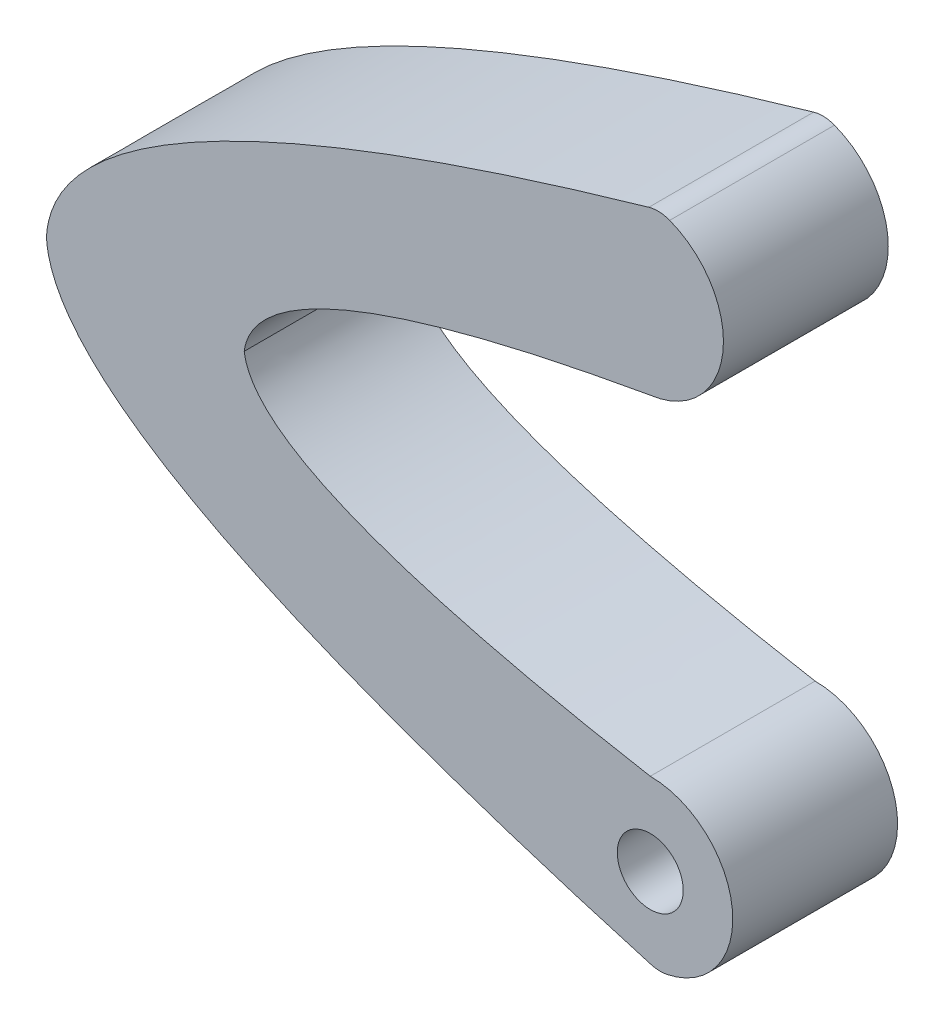
ISO-10303-21;
HEADER;
FILE_DESCRIPTION(('STEP AP214'),'2;1');
FILE_NAME('part.step','',(''),(''),'','','');
FILE_SCHEMA(('AUTOMOTIVE_DESIGN { 1 0 10303 214 1 1 1 1 }'));
ENDSEC;
DATA;
#1=APPLICATION_CONTEXT('core data for automotive mechanical design processes');
#2=APPLICATION_PROTOCOL_DEFINITION('international standard','automotive_design',2000,#1);
#3=PRODUCT_CONTEXT('',#1,'mechanical');
#4=PRODUCT('Part','Part','',(#3));
#5=PRODUCT_RELATED_PRODUCT_CATEGORY('part','',(#4));
#6=PRODUCT_DEFINITION_FORMATION('','',#4);
#7=PRODUCT_DEFINITION_CONTEXT('part definition',#1,'design');
#8=PRODUCT_DEFINITION('design','',#6,#7);
#9=PRODUCT_DEFINITION_SHAPE('','',#8);
#10=(LENGTH_UNIT() NAMED_UNIT(*) SI_UNIT(.MILLI.,.METRE.));
#11=(NAMED_UNIT(*) PLANE_ANGLE_UNIT() SI_UNIT($,.RADIAN.));
#12=(NAMED_UNIT(*) SI_UNIT($,.STERADIAN.) SOLID_ANGLE_UNIT());
#13=UNCERTAINTY_MEASURE_WITH_UNIT(LENGTH_MEASURE(1.E-05),#10,'distance_accuracy_value','');
#14=(GEOMETRIC_REPRESENTATION_CONTEXT(3) GLOBAL_UNCERTAINTY_ASSIGNED_CONTEXT((#13)) GLOBAL_UNIT_ASSIGNED_CONTEXT((#10,
#11,#12)) REPRESENTATION_CONTEXT('',''));
#15=CARTESIAN_POINT('',(0.,0.,0.));
#16=DIRECTION('',(0.,0.,1.));
#17=DIRECTION('',(1.,0.,0.));
#18=AXIS2_PLACEMENT_3D('',#15,#16,#17);
#19=CARTESIAN_POINT('',(47.5152011648523,-11.3632797067987,10.));
#20=CARTESIAN_POINT('',(10.9332546142539,-0.926951504292355,10.));
#21=CARTESIAN_POINT('',(10.4116613635407,8.6362173549119,10.));
#22=B_SPLINE_CURVE_WITH_KNOTS('',2,(#19,#20,#21),.UNSPECIFIED.,.F.,.F.,(3,3),(0.,
0.478869131783004),.UNSPECIFIED.);
#23=DIRECTION('',(0.,0.,-1.));
#24=VECTOR('',#23,1.);
#25=SURFACE_OF_LINEAR_EXTRUSION('',#22,#24);
#26=CARTESIAN_POINT('',(47.5152011648523,-11.3632797067987,0.));
#27=CARTESIAN_POINT('',(10.9332546142539,-0.926951504292355,0.));
#28=CARTESIAN_POINT('',(10.4116613635407,8.6362173549119,0.));
#29=B_SPLINE_CURVE_WITH_KNOTS('',2,(#26,#27,#28),.UNSPECIFIED.,.F.,.F.,(3,3),(0.,
0.478869131783004),.UNSPECIFIED.);
#30=CARTESIAN_POINT('',(47.1036602242918,-11.2455731833832,0.));
#31=VERTEX_POINT('',#30);
#32=CARTESIAN_POINT('',(10.4116613635407,8.6362173549119,0.));
#33=VERTEX_POINT('',#32);
#34=EDGE_CURVE('E190',#31,#33,#29,.T.);
#35=ORIENTED_EDGE('',*,*,#34,.F.);
#36=DIRECTION('',(0.,0.,-1.));
#37=VECTOR('',#36,1.);
#38=CARTESIAN_POINT('',(47.1036602242918,-11.2455731833832,0.));
#39=LINE('',#38,#37);
#40=CARTESIAN_POINT('',(47.1036602242918,-11.2455731833832,10.));
#41=VERTEX_POINT('',#40);
#42=EDGE_CURVE('E43',#31,#41,#39,.F.);
#43=ORIENTED_EDGE('',*,*,#42,.T.);
#44=CARTESIAN_POINT('',(10.4116613635407,8.6362173549119,10.));
#45=VERTEX_POINT('',#44);
#46=EDGE_CURVE('E109',#41,#45,#22,.T.);
#47=ORIENTED_EDGE('',*,*,#46,.T.);
#48=DIRECTION('',(0.,0.,-1.));
#49=VECTOR('',#48,1.);
#50=CARTESIAN_POINT('',(10.4116613635407,8.6362173549119,10.));
#51=LINE('',#50,#49);
#52=EDGE_CURVE('E169',#45,#33,#51,.T.);
#53=ORIENTED_EDGE('',*,*,#52,.T.);
#54=EDGE_LOOP('',(#35,#43,#47,#53));
#55=FACE_BOUND('',#54,.T.);
#56=ADVANCED_FACE('F35',(#55),#25,.T.);
#57=CARTESIAN_POINT('',(47.0465762802656,-6.37976549751633,10.));
#58=DIRECTION('',(0.,0.,-1.));
#59=DIRECTION('',(-1.,0.,0.));
#60=AXIS2_PLACEMENT_3D('',#57,#58,#59);
#61=CYLINDRICAL_SURFACE('',#60,5.00549929143665);
#62=CARTESIAN_POINT('',(47.0465762802656,-6.37976549751633,10.));
#63=DIRECTION('',(0.,0.,1.));
#64=DIRECTION('',(1.,0.,0.));
#65=AXIS2_PLACEMENT_3D('',#62,#63,#64);
#66=CIRCLE('',#65,5.00549929143665);
#67=CARTESIAN_POINT('',(48.0597671727555,-11.2816495610115,10.));
#68=VERTEX_POINT('',#67);
#69=CARTESIAN_POINT('',(47.0465762802656,-1.37426620607967,10.));
#70=VERTEX_POINT('',#69);
#71=EDGE_CURVE('E97',#68,#70,#66,.T.);
#72=ORIENTED_EDGE('',*,*,#71,.F.);
#73=DIRECTION('',(0.,0.,-1.));
#74=VECTOR('',#73,1.);
#75=CARTESIAN_POINT('',(48.0597671727555,-11.2816495610115,10.));
#76=LINE('',#75,#74);
#77=CARTESIAN_POINT('',(48.0597671727555,-11.2816495610115,0.));
#78=VERTEX_POINT('',#77);
#79=EDGE_CURVE('E184',#68,#78,#76,.T.);
#80=ORIENTED_EDGE('',*,*,#79,.T.);
#81=CARTESIAN_POINT('',(47.0465762802656,-6.37976549751633,0.));
#82=DIRECTION('',(0.,0.,1.));
#83=DIRECTION('',(1.,0.,0.));
#84=AXIS2_PLACEMENT_3D('',#81,#82,#83);
#85=CIRCLE('',#84,5.00549929143665);
#86=CARTESIAN_POINT('',(47.0465762802656,-1.37426620607967,0.));
#87=VERTEX_POINT('',#86);
#88=EDGE_CURVE('E114',#78,#87,#85,.T.);
#89=ORIENTED_EDGE('',*,*,#88,.T.);
#90=DIRECTION('',(0.,0.,-1.));
#91=VECTOR('',#90,1.);
#92=CARTESIAN_POINT('',(47.0465762802656,-1.37426620607967,10.));
#93=LINE('',#92,#91);
#94=EDGE_CURVE('E112',#70,#87,#93,.T.);
#95=ORIENTED_EDGE('',*,*,#94,.F.);
#96=EDGE_LOOP('',(#72,#80,#89,#95));
#97=FACE_BOUND('',#96,.T.);
#98=ADVANCED_FACE('F113',(#97),#61,.T.);
#99=CARTESIAN_POINT('',(47.0465762802656,-1.37426620607967,10.));
#100=CARTESIAN_POINT('',(23.1494655964249,2.85669468360767,10.));
#101=CARTESIAN_POINT('',(22.4116613635407,8.6362173549119,10.));
#102=B_SPLINE_CURVE_WITH_KNOTS('',2,(#99,#100,#101),.UNSPECIFIED.,.F.,.F.,(3,3),(0.,
0.485397068416266),.UNSPECIFIED.);
#103=DIRECTION('',(0.,0.,-1.));
#104=VECTOR('',#103,1.);
#105=SURFACE_OF_LINEAR_EXTRUSION('',#102,#104);
#106=CARTESIAN_POINT('',(47.0465762802656,-1.37426620607967,0.));
#107=CARTESIAN_POINT('',(23.1494655964249,2.85669468360767,0.));
#108=CARTESIAN_POINT('',(22.4116613635407,8.6362173549119,0.));
#109=B_SPLINE_CURVE_WITH_KNOTS('',2,(#106,#107,#108),.UNSPECIFIED.,.F.,.F.,(3,3),(0.,
0.485397068416266),.UNSPECIFIED.);
#110=CARTESIAN_POINT('',(22.4116613635407,8.6362173549119,0.));
#111=VERTEX_POINT('',#110);
#112=EDGE_CURVE('E189',#87,#111,#109,.T.);
#113=ORIENTED_EDGE('',*,*,#112,.T.);
#114=DIRECTION('',(0.,0.,-1.));
#115=VECTOR('',#114,1.);
#116=CARTESIAN_POINT('',(22.4116613635407,8.6362173549119,10.));
#117=LINE('',#116,#115);
#118=CARTESIAN_POINT('',(22.4116613635407,8.6362173549119,10.));
#119=VERTEX_POINT('',#118);
#120=EDGE_CURVE('E119',#119,#111,#117,.T.);
#121=ORIENTED_EDGE('',*,*,#120,.F.);
#122=EDGE_CURVE('E103',#70,#119,#102,.T.);
#123=ORIENTED_EDGE('',*,*,#122,.F.);
#124=ORIENTED_EDGE('',*,*,#94,.T.);
#125=EDGE_LOOP('',(#113,#121,#123,#124));
#126=FACE_BOUND('',#125,.T.);
#127=ADVANCED_FACE('F121',(#126),#105,.F.);
#128=CARTESIAN_POINT('',(47.0465762802655,18.6477067924824,10.));
#129=CARTESIAN_POINT('',(23.1494655964249,14.4157400262161,10.));
#130=CARTESIAN_POINT('',(22.4116613635407,8.6362173549119,10.));
#131=B_SPLINE_CURVE_WITH_KNOTS('',2,(#128,#129,#130),.UNSPECIFIED.,.F.,.F.,(3,3),(0.,
0.485397068416266),.UNSPECIFIED.);
#132=DIRECTION('',(0.,0.,-1.));
#133=VECTOR('',#132,1.);
#134=SURFACE_OF_LINEAR_EXTRUSION('',#131,#133);
#135=CARTESIAN_POINT('',(47.0465762802655,18.6477067924824,0.));
#136=CARTESIAN_POINT('',(23.1494655964249,14.4157400262161,0.));
#137=CARTESIAN_POINT('',(22.4116613635407,8.6362173549119,0.));
#138=B_SPLINE_CURVE_WITH_KNOTS('',2,(#135,#136,#137),.UNSPECIFIED.,.F.,.F.,(3,3),(0.,
0.485397068416266),.UNSPECIFIED.);
#139=CARTESIAN_POINT('',(47.0465762802655,18.6477067924824,0.));
#140=VERTEX_POINT('',#139);
#141=EDGE_CURVE('E192',#140,#111,#138,.T.);
#142=ORIENTED_EDGE('',*,*,#141,.F.);
#143=DIRECTION('',(0.,0.,-1.));
#144=VECTOR('',#143,1.);
#145=CARTESIAN_POINT('',(47.0465762802655,18.6477067924824,10.));
#146=LINE('',#145,#144);
#147=CARTESIAN_POINT('',(47.0465762802655,18.6477067924824,10.));
#148=VERTEX_POINT('',#147);
#149=EDGE_CURVE('E171',#148,#140,#146,.T.);
#150=ORIENTED_EDGE('',*,*,#149,.F.);
#151=EDGE_CURVE('E123',#148,#119,#131,.T.);
#152=ORIENTED_EDGE('',*,*,#151,.T.);
#153=ORIENTED_EDGE('',*,*,#120,.T.);
#154=EDGE_LOOP('',(#142,#150,#152,#153));
#155=FACE_BOUND('',#154,.T.);
#156=ADVANCED_FACE('F142',(#155),#134,.T.);
#157=CARTESIAN_POINT('',(46.4116613635407,23.682992501722,10.));
#158=DIRECTION('',(0.,0.,-1.));
#159=DIRECTION('',(-1.,0.,0.));
#160=AXIS2_PLACEMENT_3D('',#157,#158,#159);
#161=CYLINDRICAL_SURFACE('',#160,5.07515705423518);
#162=CARTESIAN_POINT('',(46.4116613635407,23.682992501722,0.));
#163=DIRECTION('',(0.,0.,1.));
#164=DIRECTION('',(1.,0.,0.));
#165=AXIS2_PLACEMENT_3D('',#162,#163,#164);
#166=CIRCLE('',#165,5.07515705423518);
#167=CARTESIAN_POINT('',(48.2254105436071,28.4229854381051,0.));
#168=VERTEX_POINT('',#167);
#169=EDGE_CURVE('E163',#168,#140,#166,.F.);
#170=ORIENTED_EDGE('',*,*,#169,.F.);
#171=DIRECTION('',(0.,0.,-1.));
#172=VECTOR('',#171,1.);
#173=CARTESIAN_POINT('',(48.2254105436071,28.4229854381051,10.));
#174=LINE('',#173,#172);
#175=CARTESIAN_POINT('',(48.2254105436071,28.4229854381051,10.));
#176=VERTEX_POINT('',#175);
#177=EDGE_CURVE('E180',#168,#176,#174,.F.);
#178=ORIENTED_EDGE('',*,*,#177,.T.);
#179=CARTESIAN_POINT('',(46.4116613635407,23.682992501722,10.));
#180=DIRECTION('',(0.,0.,1.));
#181=DIRECTION('',(1.,0.,0.));
#182=AXIS2_PLACEMENT_3D('',#179,#180,#181);
#183=CIRCLE('',#182,5.07515705423518);
#184=EDGE_CURVE('E125',#176,#148,#183,.F.);
#185=ORIENTED_EDGE('',*,*,#184,.T.);
#186=ORIENTED_EDGE('',*,*,#149,.T.);
#187=EDGE_LOOP('',(#170,#178,#185,#186));
#188=FACE_BOUND('',#187,.T.);
#189=ADVANCED_FACE('F215',(#188),#161,.T.);
#190=CARTESIAN_POINT('',(47.5152011648523,28.6367202932013,10.));
#191=CARTESIAN_POINT('',(10.9332546142539,18.1993862141162,10.));
#192=CARTESIAN_POINT('',(10.4116613635407,8.6362173549119,10.));
#193=B_SPLINE_CURVE_WITH_KNOTS('',2,(#190,#191,#192),.UNSPECIFIED.,.F.,.F.,(3,3),(0.,
0.478869131783004),.UNSPECIFIED.);
#194=DIRECTION('',(0.,0.,-1.));
#195=VECTOR('',#194,1.);
#196=SURFACE_OF_LINEAR_EXTRUSION('',#193,#195);
#197=CARTESIAN_POINT('',(46.9584044816055,28.4773091452483,10.));
#198=VERTEX_POINT('',#197);
#199=EDGE_CURVE('E220',#198,#45,#193,.T.);
#200=ORIENTED_EDGE('',*,*,#199,.F.);
#201=DIRECTION('',(0.,0.,-1.));
#202=VECTOR('',#201,1.);
#203=CARTESIAN_POINT('',(46.9584044816055,28.4773091452483,10.));
#204=LINE('',#203,#202);
#205=CARTESIAN_POINT('',(46.9584044816055,28.4773091452483,0.));
#206=VERTEX_POINT('',#205);
#207=EDGE_CURVE('E118',#198,#206,#204,.T.);
#208=ORIENTED_EDGE('',*,*,#207,.T.);
#209=CARTESIAN_POINT('',(47.5152011648523,28.6367202932013,0.));
#210=CARTESIAN_POINT('',(10.9332546142539,18.1993862141162,0.));
#211=CARTESIAN_POINT('',(10.4116613635407,8.6362173549119,0.));
#212=B_SPLINE_CURVE_WITH_KNOTS('',2,(#209,#210,#211),.UNSPECIFIED.,.F.,.F.,(3,3),(0.,
0.478869131783004),.UNSPECIFIED.);
#213=EDGE_CURVE('E158',#206,#33,#212,.T.);
#214=ORIENTED_EDGE('',*,*,#213,.T.);
#215=ORIENTED_EDGE('',*,*,#52,.F.);
#216=EDGE_LOOP('',(#200,#208,#214,#215));
#217=FACE_BOUND('',#216,.T.);
#218=ADVANCED_FACE('F224',(#217),#196,.F.);
#219=CARTESIAN_POINT('',(47.0465762802656,-6.37976549751633,10.));
#220=DIRECTION('',(0.,0.,-1.));
#221=DIRECTION('',(-1.,0.,0.));
#222=AXIS2_PLACEMENT_3D('',#219,#220,#221);
#223=CYLINDRICAL_SURFACE('',#222,2.);
#224=CARTESIAN_POINT('',(47.0465762802656,-6.37976549751633,10.));
#225=DIRECTION('',(0.,0.,1.));
#226=DIRECTION('',(1.,0.,0.));
#227=AXIS2_PLACEMENT_3D('',#224,#225,#226);
#228=CIRCLE('',#227,2.);
#229=CARTESIAN_POINT('',(49.0465762802656,-6.37976549751633,10.));
#230=VERTEX_POINT('',#229);
#231=EDGE_CURVE('E172',#230,#230,#228,.T.);
#232=ORIENTED_EDGE('',*,*,#231,.T.);
#233=EDGE_LOOP('',(#232));
#234=FACE_BOUND('',#233,.T.);
#235=CARTESIAN_POINT('',(47.0465762802656,-6.37976549751633,0.));
#236=DIRECTION('',(0.,0.,1.));
#237=DIRECTION('',(1.,0.,0.));
#238=AXIS2_PLACEMENT_3D('',#235,#236,#237);
#239=CIRCLE('',#238,2.);
#240=CARTESIAN_POINT('',(49.0465762802656,-6.37976549751633,0.));
#241=VERTEX_POINT('',#240);
#242=EDGE_CURVE('E151',#241,#241,#239,.T.);
#243=ORIENTED_EDGE('',*,*,#242,.F.);
#244=EDGE_LOOP('',(#243));
#245=FACE_BOUND('',#244,.T.);
#246=ADVANCED_FACE('F237',(#234,#245),#223,.F.);
#247=CARTESIAN_POINT('',(0.,0.,10.));
#248=DIRECTION('',(0.,0.,1.));
#249=DIRECTION('',(1.,0.,0.));
#250=AXIS2_PLACEMENT_3D('',#247,#248,#249);
#251=PLANE('',#250);
#252=ORIENTED_EDGE('',*,*,#46,.F.);
#253=CARTESIAN_POINT('',(47.6549360726,-9.32305011744303,10.));
#254=DIRECTION('',(0.,0.,1.));
#255=DIRECTION('',(1.,0.,0.));
#256=AXIS2_PLACEMENT_3D('',#253,#254,#255);
#257=CIRCLE('',#256,2.);
#258=EDGE_CURVE('E11',#41,#68,#257,.T.);
#259=ORIENTED_EDGE('',*,*,#258,.T.);
#260=ORIENTED_EDGE('',*,*,#71,.T.);
#261=ORIENTED_EDGE('',*,*,#122,.T.);
#262=ORIENTED_EDGE('',*,*,#151,.F.);
#263=ORIENTED_EDGE('',*,*,#184,.F.);
#264=CARTESIAN_POINT('',(47.5106546609087,26.5550657320824,10.));
#265=DIRECTION('',(0.,0.,1.));
#266=DIRECTION('',(1.,0.,0.));
#267=AXIS2_PLACEMENT_3D('',#264,#265,#266);
#268=CIRCLE('',#267,2.);
#269=EDGE_CURVE('E182',#176,#198,#268,.T.);
#270=ORIENTED_EDGE('',*,*,#269,.T.);
#271=ORIENTED_EDGE('',*,*,#199,.T.);
#272=EDGE_LOOP('',(#252,#259,#260,#261,#262,#263,#270,#271));
#273=FACE_BOUND('',#272,.T.);
#274=ORIENTED_EDGE('',*,*,#231,.F.);
#275=EDGE_LOOP('',(#274));
#276=FACE_BOUND('',#275,.T.);
#277=ADVANCED_FACE('F99',(#273,#276),#251,.T.);
#278=CARTESIAN_POINT('',(0.,0.,0.));
#279=DIRECTION('',(0.,0.,1.));
#280=DIRECTION('',(1.,0.,0.));
#281=AXIS2_PLACEMENT_3D('',#278,#279,#280);
#282=PLANE('',#281);
#283=ORIENTED_EDGE('',*,*,#88,.F.);
#284=CARTESIAN_POINT('',(47.6549360726,-9.32305011744303,0.));
#285=DIRECTION('',(0.,0.,1.));
#286=DIRECTION('',(1.,0.,0.));
#287=AXIS2_PLACEMENT_3D('',#284,#285,#286);
#288=CIRCLE('',#287,2.);
#289=EDGE_CURVE('E57',#78,#31,#288,.F.);
#290=ORIENTED_EDGE('',*,*,#289,.T.);
#291=ORIENTED_EDGE('',*,*,#34,.T.);
#292=ORIENTED_EDGE('',*,*,#213,.F.);
#293=CARTESIAN_POINT('',(47.5106546609087,26.5550657320824,0.));
#294=DIRECTION('',(0.,0.,1.));
#295=DIRECTION('',(1.,0.,0.));
#296=AXIS2_PLACEMENT_3D('',#293,#294,#295);
#297=CIRCLE('',#296,2.);
#298=EDGE_CURVE('E178',#206,#168,#297,.F.);
#299=ORIENTED_EDGE('',*,*,#298,.T.);
#300=ORIENTED_EDGE('',*,*,#169,.T.);
#301=ORIENTED_EDGE('',*,*,#141,.T.);
#302=ORIENTED_EDGE('',*,*,#112,.F.);
#303=EDGE_LOOP('',(#283,#290,#291,#292,#299,#300,#301,#302));
#304=FACE_BOUND('',#303,.T.);
#305=ORIENTED_EDGE('',*,*,#242,.T.);
#306=EDGE_LOOP('',(#305));
#307=FACE_BOUND('',#306,.T.);
#308=ADVANCED_FACE('F187',(#304,#307),#282,.F.);
#309=CARTESIAN_POINT('',(47.5106546609087,26.5550657320824,5.));
#310=DIRECTION('',(0.,0.,-1.));
#311=DIRECTION('',(-1.,0.,0.));
#312=AXIS2_PLACEMENT_3D('',#309,#310,#311);
#313=CYLINDRICAL_SURFACE('',#312,2.);
#314=ORIENTED_EDGE('',*,*,#269,.F.);
#315=ORIENTED_EDGE('',*,*,#177,.F.);
#316=ORIENTED_EDGE('',*,*,#298,.F.);
#317=ORIENTED_EDGE('',*,*,#207,.F.);
#318=EDGE_LOOP('',(#314,#315,#316,#317));
#319=FACE_BOUND('',#318,.T.);
#320=ADVANCED_FACE('F147',(#319),#313,.T.);
#321=CARTESIAN_POINT('',(47.6549360726,-9.32305011744303,5.));
#322=DIRECTION('',(0.,0.,-1.));
#323=DIRECTION('',(-1.,0.,0.));
#324=AXIS2_PLACEMENT_3D('',#321,#322,#323);
#325=CYLINDRICAL_SURFACE('',#324,2.);
#326=ORIENTED_EDGE('',*,*,#258,.F.);
#327=ORIENTED_EDGE('',*,*,#42,.F.);
#328=ORIENTED_EDGE('',*,*,#289,.F.);
#329=ORIENTED_EDGE('',*,*,#79,.F.);
#330=EDGE_LOOP('',(#326,#327,#328,#329));
#331=FACE_BOUND('',#330,.T.);
#332=ADVANCED_FACE('F37',(#331),#325,.T.);
#333=CLOSED_SHELL('',(#56,#98,#127,#156,#189,#218,#246,#277,#308,#320,#332));
#334=MANIFOLD_SOLID_BREP('B2',#333);
#335=ADVANCED_BREP_SHAPE_REPRESENTATION('',(#18,#334),#14);
#336=SHAPE_DEFINITION_REPRESENTATION(#9,#335);
ENDSEC;
END-ISO-10303-21;
